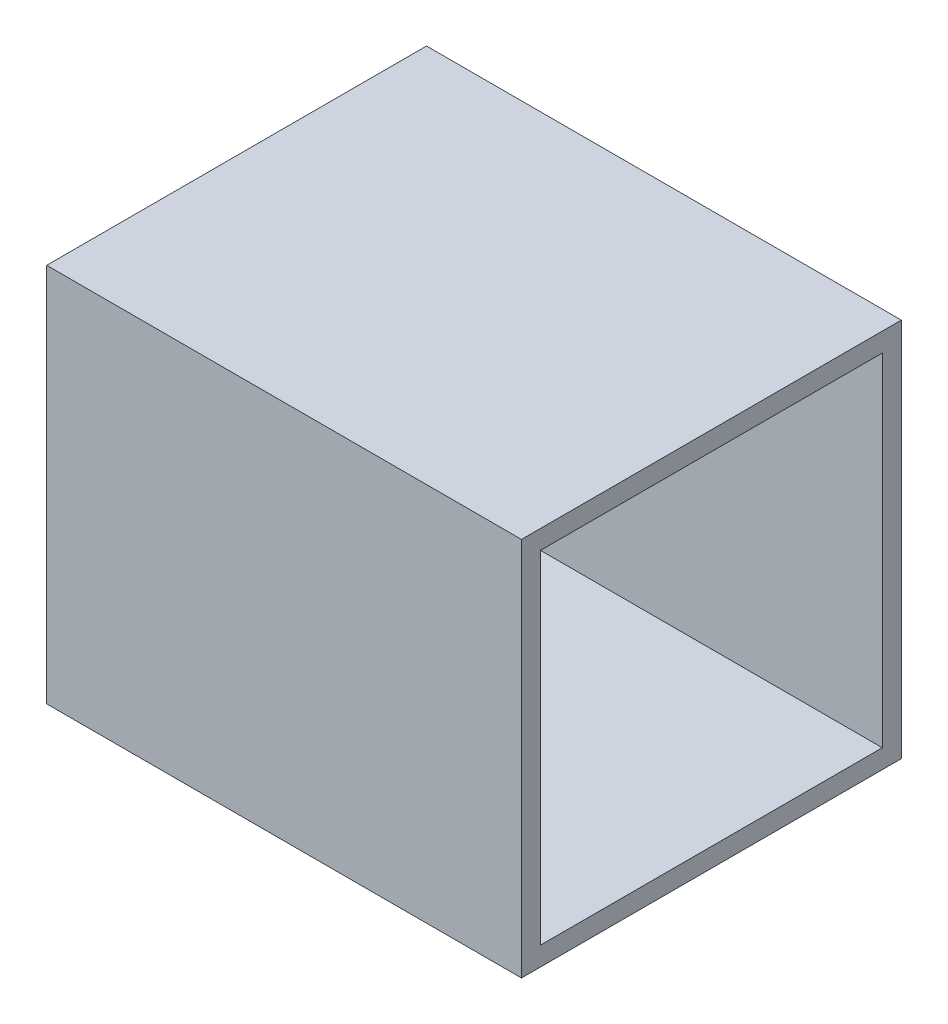
ISO-10303-21;
HEADER;
FILE_DESCRIPTION(('STEP AP214'),'2;1');
FILE_NAME('part.step','',(''),(''),'','','');
FILE_SCHEMA(('AUTOMOTIVE_DESIGN { 1 0 10303 214 1 1 1 1 }'));
ENDSEC;
DATA;
#1=APPLICATION_CONTEXT('core data for automotive mechanical design processes');
#2=APPLICATION_PROTOCOL_DEFINITION('international standard','automotive_design',2000,#1);
#3=PRODUCT_CONTEXT('',#1,'mechanical');
#4=PRODUCT('Part','Part','',(#3));
#5=PRODUCT_RELATED_PRODUCT_CATEGORY('part','',(#4));
#6=PRODUCT_DEFINITION_FORMATION('','',#4);
#7=PRODUCT_DEFINITION_CONTEXT('part definition',#1,'design');
#8=PRODUCT_DEFINITION('design','',#6,#7);
#9=PRODUCT_DEFINITION_SHAPE('','',#8);
#10=(LENGTH_UNIT() NAMED_UNIT(*) SI_UNIT(.MILLI.,.METRE.));
#11=(NAMED_UNIT(*) PLANE_ANGLE_UNIT() SI_UNIT($,.RADIAN.));
#12=(NAMED_UNIT(*) SI_UNIT($,.STERADIAN.) SOLID_ANGLE_UNIT());
#13=UNCERTAINTY_MEASURE_WITH_UNIT(LENGTH_MEASURE(1.E-05),#10,'distance_accuracy_value','');
#14=(GEOMETRIC_REPRESENTATION_CONTEXT(3) GLOBAL_UNCERTAINTY_ASSIGNED_CONTEXT((#13)) GLOBAL_UNIT_ASSIGNED_CONTEXT((#10,
#11,#12)) REPRESENTATION_CONTEXT('',''));
#15=CARTESIAN_POINT('',(0.,0.,0.));
#16=DIRECTION('',(0.,0.,1.));
#17=DIRECTION('',(1.,0.,0.));
#18=AXIS2_PLACEMENT_3D('',#15,#16,#17);
#19=CARTESIAN_POINT('',(12.7,254.,-254.));
#20=DIRECTION('',(0.,0.,1.));
#21=DIRECTION('',(0.,-1.,0.));
#22=AXIS2_PLACEMENT_3D('',#19,#20,#21);
#23=PLANE('',#22);
#24=DIRECTION('',(0.,1.,0.));
#25=VECTOR('',#24,1.);
#26=CARTESIAN_POINT('',(0.,254.,-254.));
#27=LINE('',#26,#25);
#28=CARTESIAN_POINT('',(0.,0.,-254.));
#29=VERTEX_POINT('',#28);
#30=CARTESIAN_POINT('',(0.,254.,-254.));
#31=VERTEX_POINT('',#30);
#32=EDGE_CURVE('E150',#29,#31,#27,.T.);
#33=ORIENTED_EDGE('',*,*,#32,.T.);
#34=DIRECTION('',(-1.,0.,0.));
#35=VECTOR('',#34,1.);
#36=CARTESIAN_POINT('',(12.7,254.,-254.));
#37=LINE('',#36,#35);
#38=CARTESIAN_POINT('',(317.5,254.,-254.));
#39=VERTEX_POINT('',#38);
#40=EDGE_CURVE('E11',#39,#31,#37,.T.);
#41=ORIENTED_EDGE('',*,*,#40,.F.);
#42=DIRECTION('',(0.,1.,0.));
#43=VECTOR('',#42,1.);
#44=CARTESIAN_POINT('',(317.5,0.,-254.));
#45=LINE('',#44,#43);
#46=CARTESIAN_POINT('',(317.5,0.,-254.));
#47=VERTEX_POINT('',#46);
#48=EDGE_CURVE('E141',#47,#39,#45,.T.);
#49=ORIENTED_EDGE('',*,*,#48,.F.);
#50=DIRECTION('',(-1.,0.,0.));
#51=VECTOR('',#50,1.);
#52=CARTESIAN_POINT('',(12.7,0.,-254.));
#53=LINE('',#52,#51);
#54=EDGE_CURVE('E158',#47,#29,#53,.T.);
#55=ORIENTED_EDGE('',*,*,#54,.T.);
#56=EDGE_LOOP('',(#33,#41,#49,#55));
#57=FACE_BOUND('',#56,.T.);
#58=ADVANCED_FACE('F33',(#57),#23,.F.);
#59=CARTESIAN_POINT('',(12.7,254.,-254.));
#60=DIRECTION('',(0.,-1.,0.));
#61=DIRECTION('',(0.,0.,-1.));
#62=AXIS2_PLACEMENT_3D('',#59,#60,#61);
#63=PLANE('',#62);
#64=DIRECTION('',(0.,0.,1.));
#65=VECTOR('',#64,1.);
#66=CARTESIAN_POINT('',(0.,254.,-254.));
#67=LINE('',#66,#65);
#68=CARTESIAN_POINT('',(0.,254.,0.));
#69=VERTEX_POINT('',#68);
#70=EDGE_CURVE('E153',#31,#69,#67,.T.);
#71=ORIENTED_EDGE('',*,*,#70,.T.);
#72=DIRECTION('',(-1.,0.,0.));
#73=VECTOR('',#72,1.);
#74=CARTESIAN_POINT('',(12.7,254.,0.));
#75=LINE('',#74,#73);
#76=CARTESIAN_POINT('',(317.5,254.,0.));
#77=VERTEX_POINT('',#76);
#78=EDGE_CURVE('E40',#77,#69,#75,.T.);
#79=ORIENTED_EDGE('',*,*,#78,.F.);
#80=DIRECTION('',(0.,0.,1.));
#81=VECTOR('',#80,1.);
#82=CARTESIAN_POINT('',(317.5,254.,-254.));
#83=LINE('',#82,#81);
#84=EDGE_CURVE('E144',#39,#77,#83,.T.);
#85=ORIENTED_EDGE('',*,*,#84,.F.);
#86=ORIENTED_EDGE('',*,*,#40,.T.);
#87=EDGE_LOOP('',(#71,#79,#85,#86));
#88=FACE_BOUND('',#87,.T.);
#89=ADVANCED_FACE('F176',(#88),#63,.F.);
#90=CARTESIAN_POINT('',(12.7,254.,0.));
#91=DIRECTION('',(0.,0.,-1.));
#92=DIRECTION('',(-1.,0.,0.));
#93=AXIS2_PLACEMENT_3D('',#90,#91,#92);
#94=PLANE('',#93);
#95=DIRECTION('',(0.,-1.,0.));
#96=VECTOR('',#95,1.);
#97=CARTESIAN_POINT('',(0.,254.,0.));
#98=LINE('',#97,#96);
#99=CARTESIAN_POINT('',(0.,0.,0.));
#100=VERTEX_POINT('',#99);
#101=EDGE_CURVE('E155',#69,#100,#98,.T.);
#102=ORIENTED_EDGE('',*,*,#101,.T.);
#103=DIRECTION('',(-1.,0.,0.));
#104=VECTOR('',#103,1.);
#105=CARTESIAN_POINT('',(12.7,0.,0.));
#106=LINE('',#105,#104);
#107=CARTESIAN_POINT('',(317.5,0.,0.));
#108=VERTEX_POINT('',#107);
#109=EDGE_CURVE('E160',#108,#100,#106,.T.);
#110=ORIENTED_EDGE('',*,*,#109,.F.);
#111=DIRECTION('',(0.,-1.,0.));
#112=VECTOR('',#111,1.);
#113=CARTESIAN_POINT('',(317.5,254.,0.));
#114=LINE('',#113,#112);
#115=EDGE_CURVE('E147',#77,#108,#114,.T.);
#116=ORIENTED_EDGE('',*,*,#115,.F.);
#117=ORIENTED_EDGE('',*,*,#78,.T.);
#118=EDGE_LOOP('',(#102,#110,#116,#117));
#119=FACE_BOUND('',#118,.T.);
#120=ADVANCED_FACE('F165',(#119),#94,.F.);
#121=CARTESIAN_POINT('',(12.7,0.,-254.));
#122=DIRECTION('',(0.,1.,0.));
#123=DIRECTION('',(0.,0.,1.));
#124=AXIS2_PLACEMENT_3D('',#121,#122,#123);
#125=PLANE('',#124);
#126=DIRECTION('',(0.,0.,-1.));
#127=VECTOR('',#126,1.);
#128=CARTESIAN_POINT('',(0.,0.,-254.));
#129=LINE('',#128,#127);
#130=EDGE_CURVE('E55',#100,#29,#129,.T.);
#131=ORIENTED_EDGE('',*,*,#130,.T.);
#132=ORIENTED_EDGE('',*,*,#54,.F.);
#133=DIRECTION('',(0.,0.,-1.));
#134=VECTOR('',#133,1.);
#135=CARTESIAN_POINT('',(317.5,0.,0.));
#136=LINE('',#135,#134);
#137=EDGE_CURVE('E115',#108,#47,#136,.T.);
#138=ORIENTED_EDGE('',*,*,#137,.F.);
#139=ORIENTED_EDGE('',*,*,#109,.T.);
#140=EDGE_LOOP('',(#131,#132,#138,#139));
#141=FACE_BOUND('',#140,.T.);
#142=ADVANCED_FACE('F174',(#141),#125,.F.);
#143=CARTESIAN_POINT('',(0.,0.,0.));
#144=DIRECTION('',(-1.,0.,0.));
#145=DIRECTION('',(0.,0.,1.));
#146=AXIS2_PLACEMENT_3D('',#143,#144,#145);
#147=PLANE('',#146);
#148=ORIENTED_EDGE('',*,*,#32,.F.);
#149=ORIENTED_EDGE('',*,*,#130,.F.);
#150=ORIENTED_EDGE('',*,*,#101,.F.);
#151=ORIENTED_EDGE('',*,*,#70,.F.);
#152=EDGE_LOOP('',(#148,#149,#150,#151));
#153=FACE_BOUND('',#152,.T.);
#154=ADVANCED_FACE('F170',(#153),#147,.T.);
#155=CARTESIAN_POINT('',(317.5,0.,0.));
#156=DIRECTION('',(1.,0.,0.));
#157=DIRECTION('',(0.,0.,-1.));
#158=AXIS2_PLACEMENT_3D('',#155,#156,#157);
#159=PLANE('',#158);
#160=ORIENTED_EDGE('',*,*,#137,.T.);
#161=ORIENTED_EDGE('',*,*,#48,.T.);
#162=ORIENTED_EDGE('',*,*,#84,.T.);
#163=ORIENTED_EDGE('',*,*,#115,.T.);
#164=EDGE_LOOP('',(#160,#161,#162,#163));
#165=FACE_BOUND('',#164,.T.);
#166=DIRECTION('',(0.,1.,0.));
#167=VECTOR('',#166,1.);
#168=CARTESIAN_POINT('',(317.5,12.7,-241.3));
#169=LINE('',#168,#167);
#170=CARTESIAN_POINT('',(317.5,12.7,-241.3));
#171=VERTEX_POINT('',#170);
#172=CARTESIAN_POINT('',(317.5,241.3,-241.3));
#173=VERTEX_POINT('',#172);
#174=EDGE_CURVE('E107',#171,#173,#169,.T.);
#175=ORIENTED_EDGE('',*,*,#174,.F.);
#176=DIRECTION('',(0.,0.,-1.));
#177=VECTOR('',#176,1.);
#178=CARTESIAN_POINT('',(317.5,12.7,-12.7));
#179=LINE('',#178,#177);
#180=CARTESIAN_POINT('',(317.5,12.7,-12.7));
#181=VERTEX_POINT('',#180);
#182=EDGE_CURVE('E99',#181,#171,#179,.T.);
#183=ORIENTED_EDGE('',*,*,#182,.F.);
#184=DIRECTION('',(0.,-1.,0.));
#185=VECTOR('',#184,1.);
#186=CARTESIAN_POINT('',(317.5,241.3,-12.7));
#187=LINE('',#186,#185);
#188=CARTESIAN_POINT('',(317.5,241.3,-12.7));
#189=VERTEX_POINT('',#188);
#190=EDGE_CURVE('E123',#189,#181,#187,.T.);
#191=ORIENTED_EDGE('',*,*,#190,.F.);
#192=DIRECTION('',(0.,0.,1.));
#193=VECTOR('',#192,1.);
#194=CARTESIAN_POINT('',(317.5,241.3,-241.3));
#195=LINE('',#194,#193);
#196=EDGE_CURVE('E121',#173,#189,#195,.T.);
#197=ORIENTED_EDGE('',*,*,#196,.F.);
#198=EDGE_LOOP('',(#175,#183,#191,#197));
#199=FACE_BOUND('',#198,.T.);
#200=ADVANCED_FACE('F119',(#165,#199),#159,.T.);
#201=CARTESIAN_POINT('',(317.5,12.7,-12.7));
#202=DIRECTION('',(0.,1.,0.));
#203=DIRECTION('',(0.,0.,1.));
#204=AXIS2_PLACEMENT_3D('',#201,#202,#203);
#205=PLANE('',#204);
#206=DIRECTION('',(0.,0.,-1.));
#207=VECTOR('',#206,1.);
#208=CARTESIAN_POINT('',(12.7,12.7,-12.7));
#209=LINE('',#208,#207);
#210=CARTESIAN_POINT('',(12.7,12.7,-12.7));
#211=VERTEX_POINT('',#210);
#212=CARTESIAN_POINT('',(12.7,12.7,-241.3));
#213=VERTEX_POINT('',#212);
#214=EDGE_CURVE('E127',#211,#213,#209,.T.);
#215=ORIENTED_EDGE('',*,*,#214,.F.);
#216=DIRECTION('',(-1.,0.,0.));
#217=VECTOR('',#216,1.);
#218=CARTESIAN_POINT('',(317.5,12.7,-12.7));
#219=LINE('',#218,#217);
#220=EDGE_CURVE('E47',#181,#211,#219,.T.);
#221=ORIENTED_EDGE('',*,*,#220,.F.);
#222=ORIENTED_EDGE('',*,*,#182,.T.);
#223=DIRECTION('',(-1.,0.,0.));
#224=VECTOR('',#223,1.);
#225=CARTESIAN_POINT('',(317.5,12.7,-241.3));
#226=LINE('',#225,#224);
#227=EDGE_CURVE('E102',#171,#213,#226,.T.);
#228=ORIENTED_EDGE('',*,*,#227,.T.);
#229=EDGE_LOOP('',(#215,#221,#222,#228));
#230=FACE_BOUND('',#229,.T.);
#231=ADVANCED_FACE('F101',(#230),#205,.T.);
#232=CARTESIAN_POINT('',(317.5,12.7,-241.3));
#233=DIRECTION('',(0.,0.,1.));
#234=DIRECTION('',(1.,0.,0.));
#235=AXIS2_PLACEMENT_3D('',#232,#233,#234);
#236=PLANE('',#235);
#237=DIRECTION('',(0.,1.,0.));
#238=VECTOR('',#237,1.);
#239=CARTESIAN_POINT('',(12.7,12.7,-241.3));
#240=LINE('',#239,#238);
#241=CARTESIAN_POINT('',(12.7,241.3,-241.3));
#242=VERTEX_POINT('',#241);
#243=EDGE_CURVE('E114',#213,#242,#240,.T.);
#244=ORIENTED_EDGE('',*,*,#243,.F.);
#245=ORIENTED_EDGE('',*,*,#227,.F.);
#246=ORIENTED_EDGE('',*,*,#174,.T.);
#247=DIRECTION('',(-1.,0.,0.));
#248=VECTOR('',#247,1.);
#249=CARTESIAN_POINT('',(317.5,241.3,-241.3));
#250=LINE('',#249,#248);
#251=EDGE_CURVE('E116',#173,#242,#250,.T.);
#252=ORIENTED_EDGE('',*,*,#251,.T.);
#253=EDGE_LOOP('',(#244,#245,#246,#252));
#254=FACE_BOUND('',#253,.T.);
#255=ADVANCED_FACE('F111',(#254),#236,.T.);
#256=CARTESIAN_POINT('',(317.5,241.3,-241.3));
#257=DIRECTION('',(0.,-1.,0.));
#258=DIRECTION('',(0.,0.,-1.));
#259=AXIS2_PLACEMENT_3D('',#256,#257,#258);
#260=PLANE('',#259);
#261=DIRECTION('',(0.,0.,1.));
#262=VECTOR('',#261,1.);
#263=CARTESIAN_POINT('',(12.7,241.3,-241.3));
#264=LINE('',#263,#262);
#265=CARTESIAN_POINT('',(12.7,241.3,-12.7));
#266=VERTEX_POINT('',#265);
#267=EDGE_CURVE('E130',#242,#266,#264,.T.);
#268=ORIENTED_EDGE('',*,*,#267,.F.);
#269=ORIENTED_EDGE('',*,*,#251,.F.);
#270=ORIENTED_EDGE('',*,*,#196,.T.);
#271=DIRECTION('',(-1.,0.,0.));
#272=VECTOR('',#271,1.);
#273=CARTESIAN_POINT('',(317.5,241.3,-12.7));
#274=LINE('',#273,#272);
#275=EDGE_CURVE('E136',#189,#266,#274,.T.);
#276=ORIENTED_EDGE('',*,*,#275,.T.);
#277=EDGE_LOOP('',(#268,#269,#270,#276));
#278=FACE_BOUND('',#277,.T.);
#279=ADVANCED_FACE('F199',(#278),#260,.T.);
#280=CARTESIAN_POINT('',(317.5,241.3,-12.7));
#281=DIRECTION('',(0.,0.,-1.));
#282=DIRECTION('',(-1.,0.,0.));
#283=AXIS2_PLACEMENT_3D('',#280,#281,#282);
#284=PLANE('',#283);
#285=DIRECTION('',(0.,-1.,0.));
#286=VECTOR('',#285,1.);
#287=CARTESIAN_POINT('',(12.7,241.3,-12.7));
#288=LINE('',#287,#286);
#289=EDGE_CURVE('E108',#266,#211,#288,.T.);
#290=ORIENTED_EDGE('',*,*,#289,.F.);
#291=ORIENTED_EDGE('',*,*,#275,.F.);
#292=ORIENTED_EDGE('',*,*,#190,.T.);
#293=ORIENTED_EDGE('',*,*,#220,.T.);
#294=EDGE_LOOP('',(#290,#291,#292,#293));
#295=FACE_BOUND('',#294,.T.);
#296=ADVANCED_FACE('F191',(#295),#284,.T.);
#297=CARTESIAN_POINT('',(12.7,0.,0.));
#298=DIRECTION('',(-1.,0.,0.));
#299=DIRECTION('',(0.,0.,1.));
#300=AXIS2_PLACEMENT_3D('',#297,#298,#299);
#301=PLANE('',#300);
#302=ORIENTED_EDGE('',*,*,#289,.T.);
#303=ORIENTED_EDGE('',*,*,#214,.T.);
#304=ORIENTED_EDGE('',*,*,#243,.T.);
#305=ORIENTED_EDGE('',*,*,#267,.T.);
#306=EDGE_LOOP('',(#302,#303,#304,#305));
#307=FACE_BOUND('',#306,.T.);
#308=ADVANCED_FACE('F188',(#307),#301,.F.);
#309=CLOSED_SHELL('',(#58,#89,#120,#142,#154,#200,#231,#255,#279,#296,#308));
#310=MANIFOLD_SOLID_BREP('B2',#309);
#311=ADVANCED_BREP_SHAPE_REPRESENTATION('',(#18,#310),#14);
#312=SHAPE_DEFINITION_REPRESENTATION(#9,#311);
ENDSEC;
END-ISO-10303-21;
